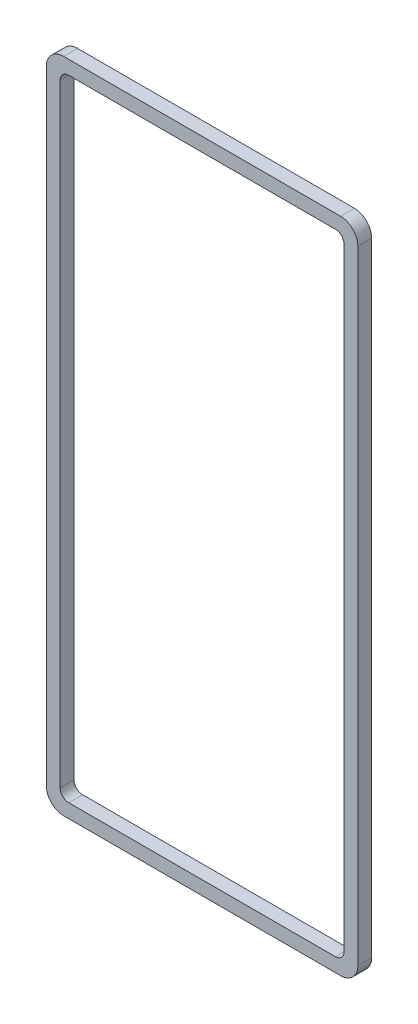
ISO-10303-21;
HEADER;
FILE_DESCRIPTION(('STEP AP214'),'2;1');
FILE_NAME('part.step','',(''),(''),'','','');
FILE_SCHEMA(('AUTOMOTIVE_DESIGN { 1 0 10303 214 1 1 1 1 }'));
ENDSEC;
DATA;
#1=APPLICATION_CONTEXT('core data for automotive mechanical design processes');
#2=APPLICATION_PROTOCOL_DEFINITION('international standard','automotive_design',2000,#1);
#3=PRODUCT_CONTEXT('',#1,'mechanical');
#4=PRODUCT('Part','Part','',(#3));
#5=PRODUCT_RELATED_PRODUCT_CATEGORY('part','',(#4));
#6=PRODUCT_DEFINITION_FORMATION('','',#4);
#7=PRODUCT_DEFINITION_CONTEXT('part definition',#1,'design');
#8=PRODUCT_DEFINITION('design','',#6,#7);
#9=PRODUCT_DEFINITION_SHAPE('','',#8);
#10=(LENGTH_UNIT() NAMED_UNIT(*) SI_UNIT(.MILLI.,.METRE.));
#11=(NAMED_UNIT(*) PLANE_ANGLE_UNIT() SI_UNIT($,.RADIAN.));
#12=(NAMED_UNIT(*) SI_UNIT($,.STERADIAN.) SOLID_ANGLE_UNIT());
#13=UNCERTAINTY_MEASURE_WITH_UNIT(LENGTH_MEASURE(1.E-05),#10,'distance_accuracy_value','');
#14=(GEOMETRIC_REPRESENTATION_CONTEXT(3) GLOBAL_UNCERTAINTY_ASSIGNED_CONTEXT((#13)) GLOBAL_UNIT_ASSIGNED_CONTEXT((#10,
#11,#12)) REPRESENTATION_CONTEXT('',''));
#15=CARTESIAN_POINT('',(0.,0.,0.));
#16=DIRECTION('',(0.,0.,1.));
#17=DIRECTION('',(1.,0.,0.));
#18=AXIS2_PLACEMENT_3D('',#15,#16,#17);
#19=CARTESIAN_POINT('',(0.,0.,40.));
#20=DIRECTION('',(0.,0.,-1.));
#21=DIRECTION('',(-1.,0.,0.));
#22=AXIS2_PLACEMENT_3D('',#19,#20,#21);
#23=PLANE('',#22);
#24=DIRECTION('',(0.,-1.,0.));
#25=VECTOR('',#24,1.);
#26=CARTESIAN_POINT('',(0.,0.,40.));
#27=LINE('',#26,#25);
#28=CARTESIAN_POINT('',(0.,1850.,40.));
#29=VERTEX_POINT('',#28);
#30=CARTESIAN_POINT('',(0.,50.,40.));
#31=VERTEX_POINT('',#30);
#32=EDGE_CURVE('E185',#29,#31,#27,.T.);
#33=ORIENTED_EDGE('',*,*,#32,.T.);
#34=CARTESIAN_POINT('',(50.,50.,40.));
#35=DIRECTION('',(0.,0.,-1.));
#36=DIRECTION('',(-1.,0.,0.));
#37=AXIS2_PLACEMENT_3D('',#34,#35,#36);
#38=CIRCLE('',#37,50.);
#39=CARTESIAN_POINT('',(50.,0.,40.));
#40=VERTEX_POINT('',#39);
#41=EDGE_CURVE('E201',#31,#40,#38,.F.);
#42=ORIENTED_EDGE('',*,*,#41,.T.);
#43=DIRECTION('',(1.,0.,0.));
#44=VECTOR('',#43,1.);
#45=CARTESIAN_POINT('',(0.,0.,40.));
#46=LINE('',#45,#44);
#47=CARTESIAN_POINT('',(850.,0.,40.));
#48=VERTEX_POINT('',#47);
#49=EDGE_CURVE('E166',#40,#48,#46,.T.);
#50=ORIENTED_EDGE('',*,*,#49,.T.);
#51=CARTESIAN_POINT('',(850.,50.,40.));
#52=DIRECTION('',(0.,0.,-1.));
#53=DIRECTION('',(-1.,0.,0.));
#54=AXIS2_PLACEMENT_3D('',#51,#52,#53);
#55=CIRCLE('',#54,50.);
#56=CARTESIAN_POINT('',(900.,50.,40.));
#57=VERTEX_POINT('',#56);
#58=EDGE_CURVE('E199',#48,#57,#55,.F.);
#59=ORIENTED_EDGE('',*,*,#58,.T.);
#60=DIRECTION('',(0.,1.,0.));
#61=VECTOR('',#60,1.);
#62=CARTESIAN_POINT('',(900.,0.,40.));
#63=LINE('',#62,#61);
#64=CARTESIAN_POINT('',(900.,1850.,40.));
#65=VERTEX_POINT('',#64);
#66=EDGE_CURVE('E277',#57,#65,#63,.T.);
#67=ORIENTED_EDGE('',*,*,#66,.T.);
#68=CARTESIAN_POINT('',(850.,1850.,40.));
#69=DIRECTION('',(0.,0.,-1.));
#70=DIRECTION('',(-1.,0.,0.));
#71=AXIS2_PLACEMENT_3D('',#68,#69,#70);
#72=CIRCLE('',#71,50.);
#73=CARTESIAN_POINT('',(850.,1900.,40.));
#74=VERTEX_POINT('',#73);
#75=EDGE_CURVE('E197',#65,#74,#72,.F.);
#76=ORIENTED_EDGE('',*,*,#75,.T.);
#77=DIRECTION('',(-1.,0.,0.));
#78=VECTOR('',#77,1.);
#79=CARTESIAN_POINT('',(0.,1900.,40.));
#80=LINE('',#79,#78);
#81=CARTESIAN_POINT('',(50.,1900.,40.));
#82=VERTEX_POINT('',#81);
#83=EDGE_CURVE('E186',#74,#82,#80,.T.);
#84=ORIENTED_EDGE('',*,*,#83,.T.);
#85=CARTESIAN_POINT('',(50.,1850.,40.));
#86=DIRECTION('',(0.,0.,-1.));
#87=DIRECTION('',(-1.,0.,0.));
#88=AXIS2_PLACEMENT_3D('',#85,#86,#87);
#89=CIRCLE('',#88,50.);
#90=EDGE_CURVE('E195',#82,#29,#89,.F.);
#91=ORIENTED_EDGE('',*,*,#90,.T.);
#92=EDGE_LOOP('',(#33,#42,#50,#59,#67,#76,#84,#91));
#93=FACE_BOUND('',#92,.T.);
#94=DIRECTION('',(0.,-1.,0.));
#95=VECTOR('',#94,1.);
#96=CARTESIAN_POINT('',(40.,40.,40.));
#97=LINE('',#96,#95);
#98=CARTESIAN_POINT('',(40.,1835.,40.));
#99=VERTEX_POINT('',#98);
#100=CARTESIAN_POINT('',(40.,65.,40.));
#101=VERTEX_POINT('',#100);
#102=EDGE_CURVE('E255',#99,#101,#97,.T.);
#103=ORIENTED_EDGE('',*,*,#102,.F.);
#104=CARTESIAN_POINT('',(65.,1835.,40.));
#105=DIRECTION('',(0.,0.,-1.));
#106=DIRECTION('',(-1.,0.,0.));
#107=AXIS2_PLACEMENT_3D('',#104,#105,#106);
#108=CIRCLE('',#107,25.);
#109=CARTESIAN_POINT('',(65.,1860.,40.));
#110=VERTEX_POINT('',#109);
#111=EDGE_CURVE('E234',#99,#110,#108,.T.);
#112=ORIENTED_EDGE('',*,*,#111,.T.);
#113=DIRECTION('',(-1.,0.,0.));
#114=VECTOR('',#113,1.);
#115=CARTESIAN_POINT('',(40.,1860.,40.));
#116=LINE('',#115,#114);
#117=CARTESIAN_POINT('',(835.,1860.,40.));
#118=VERTEX_POINT('',#117);
#119=EDGE_CURVE('E179',#118,#110,#116,.T.);
#120=ORIENTED_EDGE('',*,*,#119,.F.);
#121=CARTESIAN_POINT('',(835.,1835.,40.));
#122=DIRECTION('',(0.,0.,-1.));
#123=DIRECTION('',(-1.,0.,0.));
#124=AXIS2_PLACEMENT_3D('',#121,#122,#123);
#125=CIRCLE('',#124,25.);
#126=CARTESIAN_POINT('',(860.,1835.,40.));
#127=VERTEX_POINT('',#126);
#128=EDGE_CURVE('E11',#118,#127,#125,.T.);
#129=ORIENTED_EDGE('',*,*,#128,.T.);
#130=DIRECTION('',(0.,1.,0.));
#131=VECTOR('',#130,1.);
#132=CARTESIAN_POINT('',(860.,40.,40.));
#133=LINE('',#132,#131);
#134=CARTESIAN_POINT('',(860.,65.,40.));
#135=VERTEX_POINT('',#134);
#136=EDGE_CURVE('E258',#135,#127,#133,.T.);
#137=ORIENTED_EDGE('',*,*,#136,.F.);
#138=CARTESIAN_POINT('',(835.,65.,40.));
#139=DIRECTION('',(0.,0.,-1.));
#140=DIRECTION('',(-1.,0.,0.));
#141=AXIS2_PLACEMENT_3D('',#138,#139,#140);
#142=CIRCLE('',#141,25.);
#143=CARTESIAN_POINT('',(835.,40.,40.));
#144=VERTEX_POINT('',#143);
#145=EDGE_CURVE('E242',#135,#144,#142,.T.);
#146=ORIENTED_EDGE('',*,*,#145,.T.);
#147=DIRECTION('',(1.,0.,0.));
#148=VECTOR('',#147,1.);
#149=CARTESIAN_POINT('',(40.,40.,40.));
#150=LINE('',#149,#148);
#151=CARTESIAN_POINT('',(65.,40.,40.));
#152=VERTEX_POINT('',#151);
#153=EDGE_CURVE('E260',#152,#144,#150,.T.);
#154=ORIENTED_EDGE('',*,*,#153,.F.);
#155=CARTESIAN_POINT('',(65.,65.,40.));
#156=DIRECTION('',(0.,0.,-1.));
#157=DIRECTION('',(-1.,0.,0.));
#158=AXIS2_PLACEMENT_3D('',#155,#156,#157);
#159=CIRCLE('',#158,25.);
#160=EDGE_CURVE('E238',#152,#101,#159,.T.);
#161=ORIENTED_EDGE('',*,*,#160,.T.);
#162=EDGE_LOOP('',(#103,#112,#120,#129,#137,#146,#154,#161));
#163=FACE_BOUND('',#162,.T.);
#164=ADVANCED_FACE('F33',(#93,#163),#23,.F.);
#165=CARTESIAN_POINT('',(0.,0.,0.));
#166=DIRECTION('',(0.,0.,-1.));
#167=DIRECTION('',(-1.,0.,0.));
#168=AXIS2_PLACEMENT_3D('',#165,#166,#167);
#169=PLANE('',#168);
#170=DIRECTION('',(1.,0.,0.));
#171=VECTOR('',#170,1.);
#172=CARTESIAN_POINT('',(0.,0.,0.));
#173=LINE('',#172,#171);
#174=CARTESIAN_POINT('',(50.,0.,0.));
#175=VERTEX_POINT('',#174);
#176=CARTESIAN_POINT('',(850.,0.,0.));
#177=VERTEX_POINT('',#176);
#178=EDGE_CURVE('E163',#175,#177,#173,.T.);
#179=ORIENTED_EDGE('',*,*,#178,.F.);
#180=CARTESIAN_POINT('',(50.,50.,0.));
#181=DIRECTION('',(0.,0.,-1.));
#182=DIRECTION('',(-1.,0.,0.));
#183=AXIS2_PLACEMENT_3D('',#180,#181,#182);
#184=CIRCLE('',#183,50.);
#185=CARTESIAN_POINT('',(0.,50.,0.));
#186=VERTEX_POINT('',#185);
#187=EDGE_CURVE('E146',#175,#186,#184,.T.);
#188=ORIENTED_EDGE('',*,*,#187,.T.);
#189=DIRECTION('',(0.,-1.,0.));
#190=VECTOR('',#189,1.);
#191=CARTESIAN_POINT('',(0.,0.,0.));
#192=LINE('',#191,#190);
#193=CARTESIAN_POINT('',(0.,1850.,0.));
#194=VERTEX_POINT('',#193);
#195=EDGE_CURVE('E174',#194,#186,#192,.T.);
#196=ORIENTED_EDGE('',*,*,#195,.F.);
#197=CARTESIAN_POINT('',(50.,1850.,0.));
#198=DIRECTION('',(0.,0.,-1.));
#199=DIRECTION('',(-1.,0.,0.));
#200=AXIS2_PLACEMENT_3D('',#197,#198,#199);
#201=CIRCLE('',#200,50.);
#202=CARTESIAN_POINT('',(50.,1900.,0.));
#203=VERTEX_POINT('',#202);
#204=EDGE_CURVE('E167',#194,#203,#201,.T.);
#205=ORIENTED_EDGE('',*,*,#204,.T.);
#206=DIRECTION('',(-1.,0.,0.));
#207=VECTOR('',#206,1.);
#208=CARTESIAN_POINT('',(0.,1900.,0.));
#209=LINE('',#208,#207);
#210=CARTESIAN_POINT('',(850.,1900.,0.));
#211=VERTEX_POINT('',#210);
#212=EDGE_CURVE('E177',#211,#203,#209,.T.);
#213=ORIENTED_EDGE('',*,*,#212,.F.);
#214=CARTESIAN_POINT('',(850.,1850.,0.));
#215=DIRECTION('',(0.,0.,-1.));
#216=DIRECTION('',(-1.,0.,0.));
#217=AXIS2_PLACEMENT_3D('',#214,#215,#216);
#218=CIRCLE('',#217,50.);
#219=CARTESIAN_POINT('',(900.,1850.,0.));
#220=VERTEX_POINT('',#219);
#221=EDGE_CURVE('E189',#211,#220,#218,.T.);
#222=ORIENTED_EDGE('',*,*,#221,.T.);
#223=DIRECTION('',(0.,1.,0.));
#224=VECTOR('',#223,1.);
#225=CARTESIAN_POINT('',(900.,0.,0.));
#226=LINE('',#225,#224);
#227=CARTESIAN_POINT('',(900.,50.,0.));
#228=VERTEX_POINT('',#227);
#229=EDGE_CURVE('E173',#228,#220,#226,.T.);
#230=ORIENTED_EDGE('',*,*,#229,.F.);
#231=CARTESIAN_POINT('',(850.,50.,0.));
#232=DIRECTION('',(0.,0.,-1.));
#233=DIRECTION('',(-1.,0.,0.));
#234=AXIS2_PLACEMENT_3D('',#231,#232,#233);
#235=CIRCLE('',#234,50.);
#236=EDGE_CURVE('E157',#228,#177,#235,.T.);
#237=ORIENTED_EDGE('',*,*,#236,.T.);
#238=EDGE_LOOP('',(#179,#188,#196,#205,#213,#222,#230,#237));
#239=FACE_BOUND('',#238,.T.);
#240=DIRECTION('',(0.,1.,0.));
#241=VECTOR('',#240,1.);
#242=CARTESIAN_POINT('',(860.,40.,0.));
#243=LINE('',#242,#241);
#244=CARTESIAN_POINT('',(860.,65.,0.));
#245=VERTEX_POINT('',#244);
#246=CARTESIAN_POINT('',(860.,1835.,0.));
#247=VERTEX_POINT('',#246);
#248=EDGE_CURVE('E247',#245,#247,#243,.T.);
#249=ORIENTED_EDGE('',*,*,#248,.T.);
#250=CARTESIAN_POINT('',(835.,1835.,0.));
#251=DIRECTION('',(0.,0.,-1.));
#252=DIRECTION('',(-1.,0.,0.));
#253=AXIS2_PLACEMENT_3D('',#250,#251,#252);
#254=CIRCLE('',#253,25.);
#255=CARTESIAN_POINT('',(835.,1860.,0.));
#256=VERTEX_POINT('',#255);
#257=EDGE_CURVE('E41',#247,#256,#254,.F.);
#258=ORIENTED_EDGE('',*,*,#257,.T.);
#259=DIRECTION('',(-1.,0.,0.));
#260=VECTOR('',#259,1.);
#261=CARTESIAN_POINT('',(40.,1860.,0.));
#262=LINE('',#261,#260);
#263=CARTESIAN_POINT('',(65.,1860.,0.));
#264=VERTEX_POINT('',#263);
#265=EDGE_CURVE('E246',#256,#264,#262,.T.);
#266=ORIENTED_EDGE('',*,*,#265,.T.);
#267=CARTESIAN_POINT('',(65.,1835.,0.));
#268=DIRECTION('',(0.,0.,-1.));
#269=DIRECTION('',(-1.,0.,0.));
#270=AXIS2_PLACEMENT_3D('',#267,#268,#269);
#271=CIRCLE('',#270,25.);
#272=CARTESIAN_POINT('',(40.,1835.,0.));
#273=VERTEX_POINT('',#272);
#274=EDGE_CURVE('E232',#264,#273,#271,.F.);
#275=ORIENTED_EDGE('',*,*,#274,.T.);
#276=DIRECTION('',(0.,-1.,0.));
#277=VECTOR('',#276,1.);
#278=CARTESIAN_POINT('',(40.,40.,0.));
#279=LINE('',#278,#277);
#280=CARTESIAN_POINT('',(40.,65.,0.));
#281=VERTEX_POINT('',#280);
#282=EDGE_CURVE('E267',#273,#281,#279,.T.);
#283=ORIENTED_EDGE('',*,*,#282,.T.);
#284=CARTESIAN_POINT('',(65.,65.,0.));
#285=DIRECTION('',(0.,0.,-1.));
#286=DIRECTION('',(-1.,0.,0.));
#287=AXIS2_PLACEMENT_3D('',#284,#285,#286);
#288=CIRCLE('',#287,25.);
#289=CARTESIAN_POINT('',(65.,40.,0.));
#290=VERTEX_POINT('',#289);
#291=EDGE_CURVE('E236',#281,#290,#288,.F.);
#292=ORIENTED_EDGE('',*,*,#291,.T.);
#293=DIRECTION('',(1.,0.,0.));
#294=VECTOR('',#293,1.);
#295=CARTESIAN_POINT('',(40.,40.,0.));
#296=LINE('',#295,#294);
#297=CARTESIAN_POINT('',(835.,40.,0.));
#298=VERTEX_POINT('',#297);
#299=EDGE_CURVE('E270',#290,#298,#296,.T.);
#300=ORIENTED_EDGE('',*,*,#299,.T.);
#301=CARTESIAN_POINT('',(835.,65.,0.));
#302=DIRECTION('',(0.,0.,-1.));
#303=DIRECTION('',(-1.,0.,0.));
#304=AXIS2_PLACEMENT_3D('',#301,#302,#303);
#305=CIRCLE('',#304,25.);
#306=EDGE_CURVE('E240',#298,#245,#305,.F.);
#307=ORIENTED_EDGE('',*,*,#306,.T.);
#308=EDGE_LOOP('',(#249,#258,#266,#275,#283,#292,#300,#307));
#309=FACE_BOUND('',#308,.T.);
#310=ADVANCED_FACE('F170',(#239,#309),#169,.T.);
#311=CARTESIAN_POINT('',(0.,0.,40.));
#312=DIRECTION('',(1.,0.,0.));
#313=DIRECTION('',(0.,0.,-1.));
#314=AXIS2_PLACEMENT_3D('',#311,#312,#313);
#315=PLANE('',#314);
#316=ORIENTED_EDGE('',*,*,#195,.T.);
#317=DIRECTION('',(0.,0.,-1.));
#318=VECTOR('',#317,1.);
#319=CARTESIAN_POINT('',(0.,50.,40.));
#320=LINE('',#319,#318);
#321=EDGE_CURVE('E151',#186,#31,#320,.F.);
#322=ORIENTED_EDGE('',*,*,#321,.T.);
#323=ORIENTED_EDGE('',*,*,#32,.F.);
#324=DIRECTION('',(0.,0.,-1.));
#325=VECTOR('',#324,1.);
#326=CARTESIAN_POINT('',(0.,1850.,40.));
#327=LINE('',#326,#325);
#328=EDGE_CURVE('E156',#29,#194,#327,.T.);
#329=ORIENTED_EDGE('',*,*,#328,.T.);
#330=EDGE_LOOP('',(#316,#322,#323,#329));
#331=FACE_BOUND('',#330,.T.);
#332=ADVANCED_FACE('F292',(#331),#315,.F.);
#333=CARTESIAN_POINT('',(0.,0.,40.));
#334=DIRECTION('',(0.,1.,0.));
#335=DIRECTION('',(0.,0.,1.));
#336=AXIS2_PLACEMENT_3D('',#333,#334,#335);
#337=PLANE('',#336);
#338=ORIENTED_EDGE('',*,*,#49,.F.);
#339=DIRECTION('',(0.,0.,-1.));
#340=VECTOR('',#339,1.);
#341=CARTESIAN_POINT('',(50.,0.,40.));
#342=LINE('',#341,#340);
#343=EDGE_CURVE('E150',#40,#175,#342,.T.);
#344=ORIENTED_EDGE('',*,*,#343,.T.);
#345=ORIENTED_EDGE('',*,*,#178,.T.);
#346=DIRECTION('',(0.,0.,-1.));
#347=VECTOR('',#346,1.);
#348=CARTESIAN_POINT('',(850.,0.,40.));
#349=LINE('',#348,#347);
#350=EDGE_CURVE('E168',#177,#48,#349,.F.);
#351=ORIENTED_EDGE('',*,*,#350,.T.);
#352=EDGE_LOOP('',(#338,#344,#345,#351));
#353=FACE_BOUND('',#352,.T.);
#354=ADVANCED_FACE('F162',(#353),#337,.F.);
#355=CARTESIAN_POINT('',(900.,0.,40.));
#356=DIRECTION('',(-1.,0.,0.));
#357=DIRECTION('',(0.,0.,1.));
#358=AXIS2_PLACEMENT_3D('',#355,#356,#357);
#359=PLANE('',#358);
#360=ORIENTED_EDGE('',*,*,#66,.F.);
#361=DIRECTION('',(0.,0.,-1.));
#362=VECTOR('',#361,1.);
#363=CARTESIAN_POINT('',(900.,50.,40.));
#364=LINE('',#363,#362);
#365=EDGE_CURVE('E205',#57,#228,#364,.T.);
#366=ORIENTED_EDGE('',*,*,#365,.T.);
#367=ORIENTED_EDGE('',*,*,#229,.T.);
#368=DIRECTION('',(0.,0.,-1.));
#369=VECTOR('',#368,1.);
#370=CARTESIAN_POINT('',(900.,1850.,40.));
#371=LINE('',#370,#369);
#372=EDGE_CURVE('E203',#220,#65,#371,.F.);
#373=ORIENTED_EDGE('',*,*,#372,.T.);
#374=EDGE_LOOP('',(#360,#366,#367,#373));
#375=FACE_BOUND('',#374,.T.);
#376=ADVANCED_FACE('F300',(#375),#359,.F.);
#377=CARTESIAN_POINT('',(0.,1900.,40.));
#378=DIRECTION('',(0.,-1.,0.));
#379=DIRECTION('',(0.,0.,-1.));
#380=AXIS2_PLACEMENT_3D('',#377,#378,#379);
#381=PLANE('',#380);
#382=ORIENTED_EDGE('',*,*,#83,.F.);
#383=DIRECTION('',(0.,0.,-1.));
#384=VECTOR('',#383,1.);
#385=CARTESIAN_POINT('',(850.,1900.,40.));
#386=LINE('',#385,#384);
#387=EDGE_CURVE('E210',#74,#211,#386,.T.);
#388=ORIENTED_EDGE('',*,*,#387,.T.);
#389=ORIENTED_EDGE('',*,*,#212,.T.);
#390=DIRECTION('',(0.,0.,-1.));
#391=VECTOR('',#390,1.);
#392=CARTESIAN_POINT('',(50.,1900.,40.));
#393=LINE('',#392,#391);
#394=EDGE_CURVE('E208',#203,#82,#393,.F.);
#395=ORIENTED_EDGE('',*,*,#394,.T.);
#396=EDGE_LOOP('',(#382,#388,#389,#395));
#397=FACE_BOUND('',#396,.T.);
#398=ADVANCED_FACE('F294',(#397),#381,.F.);
#399=CARTESIAN_POINT('',(40.,40.,40.));
#400=DIRECTION('',(1.,0.,0.));
#401=DIRECTION('',(0.,0.,-1.));
#402=AXIS2_PLACEMENT_3D('',#399,#400,#401);
#403=PLANE('',#402);
#404=ORIENTED_EDGE('',*,*,#282,.F.);
#405=DIRECTION('',(0.,0.,-1.));
#406=VECTOR('',#405,1.);
#407=CARTESIAN_POINT('',(40.,1835.,40.));
#408=LINE('',#407,#406);
#409=EDGE_CURVE('E221',#273,#99,#408,.F.);
#410=ORIENTED_EDGE('',*,*,#409,.T.);
#411=ORIENTED_EDGE('',*,*,#102,.T.);
#412=DIRECTION('',(0.,0.,-1.));
#413=VECTOR('',#412,1.);
#414=CARTESIAN_POINT('',(40.,65.,0.));
#415=LINE('',#414,#413);
#416=EDGE_CURVE('E218',#101,#281,#415,.T.);
#417=ORIENTED_EDGE('',*,*,#416,.T.);
#418=EDGE_LOOP('',(#404,#410,#411,#417));
#419=FACE_BOUND('',#418,.T.);
#420=ADVANCED_FACE('F320',(#419),#403,.T.);
#421=CARTESIAN_POINT('',(40.,40.,40.));
#422=DIRECTION('',(0.,1.,0.));
#423=DIRECTION('',(0.,0.,1.));
#424=AXIS2_PLACEMENT_3D('',#421,#422,#423);
#425=PLANE('',#424);
#426=ORIENTED_EDGE('',*,*,#299,.F.);
#427=DIRECTION('',(0.,0.,-1.));
#428=VECTOR('',#427,1.);
#429=CARTESIAN_POINT('',(65.,40.,40.));
#430=LINE('',#429,#428);
#431=EDGE_CURVE('E226',#290,#152,#430,.F.);
#432=ORIENTED_EDGE('',*,*,#431,.T.);
#433=ORIENTED_EDGE('',*,*,#153,.T.);
#434=DIRECTION('',(0.,0.,-1.));
#435=VECTOR('',#434,1.);
#436=CARTESIAN_POINT('',(835.,40.,0.));
#437=LINE('',#436,#435);
#438=EDGE_CURVE('E223',#144,#298,#437,.T.);
#439=ORIENTED_EDGE('',*,*,#438,.T.);
#440=EDGE_LOOP('',(#426,#432,#433,#439));
#441=FACE_BOUND('',#440,.T.);
#442=ADVANCED_FACE('F353',(#441),#425,.T.);
#443=CARTESIAN_POINT('',(860.,40.,40.));
#444=DIRECTION('',(-1.,0.,0.));
#445=DIRECTION('',(0.,0.,1.));
#446=AXIS2_PLACEMENT_3D('',#443,#444,#445);
#447=PLANE('',#446);
#448=ORIENTED_EDGE('',*,*,#248,.F.);
#449=DIRECTION('',(0.,0.,-1.));
#450=VECTOR('',#449,1.);
#451=CARTESIAN_POINT('',(860.,65.,40.));
#452=LINE('',#451,#450);
#453=EDGE_CURVE('E53',#245,#135,#452,.F.);
#454=ORIENTED_EDGE('',*,*,#453,.T.);
#455=ORIENTED_EDGE('',*,*,#136,.T.);
#456=DIRECTION('',(0.,0.,-1.));
#457=VECTOR('',#456,1.);
#458=CARTESIAN_POINT('',(860.,1835.,0.));
#459=LINE('',#458,#457);
#460=EDGE_CURVE('E228',#127,#247,#459,.T.);
#461=ORIENTED_EDGE('',*,*,#460,.T.);
#462=EDGE_LOOP('',(#448,#454,#455,#461));
#463=FACE_BOUND('',#462,.T.);
#464=ADVANCED_FACE('F257',(#463),#447,.T.);
#465=CARTESIAN_POINT('',(40.,1860.,40.));
#466=DIRECTION('',(0.,-1.,0.));
#467=DIRECTION('',(0.,0.,-1.));
#468=AXIS2_PLACEMENT_3D('',#465,#466,#467);
#469=PLANE('',#468);
#470=ORIENTED_EDGE('',*,*,#119,.T.);
#471=DIRECTION('',(0.,0.,-1.));
#472=VECTOR('',#471,1.);
#473=CARTESIAN_POINT('',(65.,1860.,0.));
#474=LINE('',#473,#472);
#475=EDGE_CURVE('E215',#110,#264,#474,.T.);
#476=ORIENTED_EDGE('',*,*,#475,.T.);
#477=ORIENTED_EDGE('',*,*,#265,.F.);
#478=DIRECTION('',(0.,0.,-1.));
#479=VECTOR('',#478,1.);
#480=CARTESIAN_POINT('',(835.,1860.,40.));
#481=LINE('',#480,#479);
#482=EDGE_CURVE('E213',#256,#118,#481,.F.);
#483=ORIENTED_EDGE('',*,*,#482,.T.);
#484=EDGE_LOOP('',(#470,#476,#477,#483));
#485=FACE_BOUND('',#484,.T.);
#486=ADVANCED_FACE('F253',(#485),#469,.T.);
#487=CARTESIAN_POINT('',(50.,50.,40.));
#488=DIRECTION('',(0.,0.,-1.));
#489=DIRECTION('',(-1.,0.,0.));
#490=AXIS2_PLACEMENT_3D('',#487,#488,#489);
#491=CYLINDRICAL_SURFACE('',#490,50.);
#492=ORIENTED_EDGE('',*,*,#41,.F.);
#493=ORIENTED_EDGE('',*,*,#321,.F.);
#494=ORIENTED_EDGE('',*,*,#187,.F.);
#495=ORIENTED_EDGE('',*,*,#343,.F.);
#496=EDGE_LOOP('',(#492,#493,#494,#495));
#497=FACE_BOUND('',#496,.T.);
#498=ADVANCED_FACE('F149',(#497),#491,.T.);
#499=CARTESIAN_POINT('',(850.,50.,40.));
#500=DIRECTION('',(0.,0.,-1.));
#501=DIRECTION('',(-1.,0.,0.));
#502=AXIS2_PLACEMENT_3D('',#499,#500,#501);
#503=CYLINDRICAL_SURFACE('',#502,50.);
#504=ORIENTED_EDGE('',*,*,#58,.F.);
#505=ORIENTED_EDGE('',*,*,#350,.F.);
#506=ORIENTED_EDGE('',*,*,#236,.F.);
#507=ORIENTED_EDGE('',*,*,#365,.F.);
#508=EDGE_LOOP('',(#504,#505,#506,#507));
#509=FACE_BOUND('',#508,.T.);
#510=ADVANCED_FACE('F304',(#509),#503,.T.);
#511=CARTESIAN_POINT('',(850.,1850.,40.));
#512=DIRECTION('',(0.,0.,-1.));
#513=DIRECTION('',(-1.,0.,0.));
#514=AXIS2_PLACEMENT_3D('',#511,#512,#513);
#515=CYLINDRICAL_SURFACE('',#514,50.);
#516=ORIENTED_EDGE('',*,*,#75,.F.);
#517=ORIENTED_EDGE('',*,*,#372,.F.);
#518=ORIENTED_EDGE('',*,*,#221,.F.);
#519=ORIENTED_EDGE('',*,*,#387,.F.);
#520=EDGE_LOOP('',(#516,#517,#518,#519));
#521=FACE_BOUND('',#520,.T.);
#522=ADVANCED_FACE('F296',(#521),#515,.T.);
#523=CARTESIAN_POINT('',(50.,1850.,40.));
#524=DIRECTION('',(0.,0.,-1.));
#525=DIRECTION('',(-1.,0.,0.));
#526=AXIS2_PLACEMENT_3D('',#523,#524,#525);
#527=CYLINDRICAL_SURFACE('',#526,50.);
#528=ORIENTED_EDGE('',*,*,#90,.F.);
#529=ORIENTED_EDGE('',*,*,#394,.F.);
#530=ORIENTED_EDGE('',*,*,#204,.F.);
#531=ORIENTED_EDGE('',*,*,#328,.F.);
#532=EDGE_LOOP('',(#528,#529,#530,#531));
#533=FACE_BOUND('',#532,.T.);
#534=ADVANCED_FACE('F290',(#533),#527,.T.);
#535=CARTESIAN_POINT('',(65.,1835.,40.));
#536=DIRECTION('',(0.,0.,1.));
#537=DIRECTION('',(1.,0.,0.));
#538=AXIS2_PLACEMENT_3D('',#535,#536,#537);
#539=CYLINDRICAL_SURFACE('',#538,25.);
#540=ORIENTED_EDGE('',*,*,#111,.F.);
#541=ORIENTED_EDGE('',*,*,#409,.F.);
#542=ORIENTED_EDGE('',*,*,#274,.F.);
#543=ORIENTED_EDGE('',*,*,#475,.F.);
#544=EDGE_LOOP('',(#540,#541,#542,#543));
#545=FACE_BOUND('',#544,.T.);
#546=ADVANCED_FACE('F394',(#545),#539,.F.);
#547=CARTESIAN_POINT('',(65.,65.,40.));
#548=DIRECTION('',(0.,0.,1.));
#549=DIRECTION('',(1.,0.,0.));
#550=AXIS2_PLACEMENT_3D('',#547,#548,#549);
#551=CYLINDRICAL_SURFACE('',#550,25.);
#552=ORIENTED_EDGE('',*,*,#160,.F.);
#553=ORIENTED_EDGE('',*,*,#431,.F.);
#554=ORIENTED_EDGE('',*,*,#291,.F.);
#555=ORIENTED_EDGE('',*,*,#416,.F.);
#556=EDGE_LOOP('',(#552,#553,#554,#555));
#557=FACE_BOUND('',#556,.T.);
#558=ADVANCED_FACE('F427',(#557),#551,.F.);
#559=CARTESIAN_POINT('',(835.,65.,40.));
#560=DIRECTION('',(0.,0.,1.));
#561=DIRECTION('',(1.,0.,0.));
#562=AXIS2_PLACEMENT_3D('',#559,#560,#561);
#563=CYLINDRICAL_SURFACE('',#562,25.);
#564=ORIENTED_EDGE('',*,*,#145,.F.);
#565=ORIENTED_EDGE('',*,*,#453,.F.);
#566=ORIENTED_EDGE('',*,*,#306,.F.);
#567=ORIENTED_EDGE('',*,*,#438,.F.);
#568=EDGE_LOOP('',(#564,#565,#566,#567));
#569=FACE_BOUND('',#568,.T.);
#570=ADVANCED_FACE('F434',(#569),#563,.F.);
#571=CARTESIAN_POINT('',(835.,1835.,40.));
#572=DIRECTION('',(0.,0.,1.));
#573=DIRECTION('',(1.,0.,0.));
#574=AXIS2_PLACEMENT_3D('',#571,#572,#573);
#575=CYLINDRICAL_SURFACE('',#574,25.);
#576=ORIENTED_EDGE('',*,*,#128,.F.);
#577=ORIENTED_EDGE('',*,*,#482,.F.);
#578=ORIENTED_EDGE('',*,*,#257,.F.);
#579=ORIENTED_EDGE('',*,*,#460,.F.);
#580=EDGE_LOOP('',(#576,#577,#578,#579));
#581=FACE_BOUND('',#580,.T.);
#582=ADVANCED_FACE('F35',(#581),#575,.F.);
#583=CLOSED_SHELL('',(#164,#310,#332,#354,#376,#398,#420,#442,#464,#486,#498,#510,#522,#534,
#546,#558,#570,#582));
#584=MANIFOLD_SOLID_BREP('B2',#583);
#585=ADVANCED_BREP_SHAPE_REPRESENTATION('',(#18,#584),#14);
#586=SHAPE_DEFINITION_REPRESENTATION(#9,#585);
ENDSEC;
END-ISO-10303-21;
